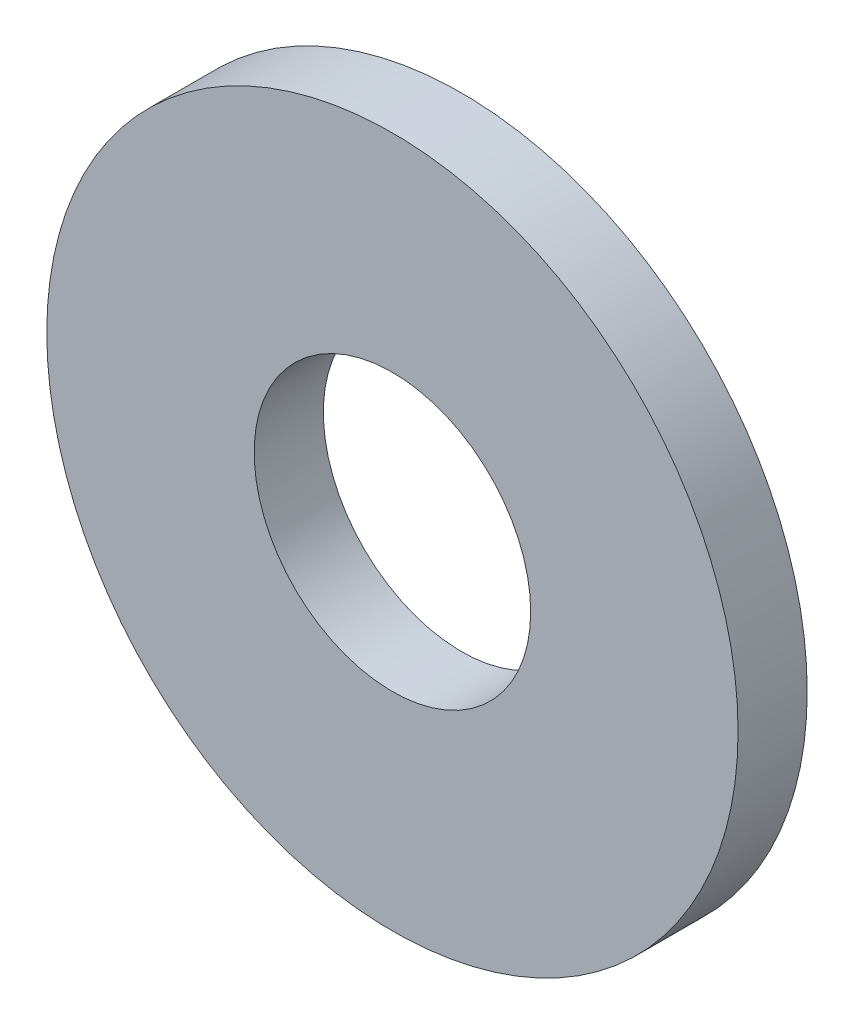
ISO-10303-21;
HEADER;
FILE_DESCRIPTION(('STEP AP214'),'2;1');
FILE_NAME('part.step','',(''),(''),'','','');
FILE_SCHEMA(('AUTOMOTIVE_DESIGN { 1 0 10303 214 1 1 1 1 }'));
ENDSEC;
DATA;
#1=APPLICATION_CONTEXT('core data for automotive mechanical design processes');
#2=APPLICATION_PROTOCOL_DEFINITION('international standard','automotive_design',2000,#1);
#3=PRODUCT_CONTEXT('',#1,'mechanical');
#4=PRODUCT('Part','Part','',(#3));
#5=PRODUCT_RELATED_PRODUCT_CATEGORY('part','',(#4));
#6=PRODUCT_DEFINITION_FORMATION('','',#4);
#7=PRODUCT_DEFINITION_CONTEXT('part definition',#1,'design');
#8=PRODUCT_DEFINITION('design','',#6,#7);
#9=PRODUCT_DEFINITION_SHAPE('','',#8);
#10=(LENGTH_UNIT() NAMED_UNIT(*) SI_UNIT(.MILLI.,.METRE.));
#11=(NAMED_UNIT(*) PLANE_ANGLE_UNIT() SI_UNIT($,.RADIAN.));
#12=(NAMED_UNIT(*) SI_UNIT($,.STERADIAN.) SOLID_ANGLE_UNIT());
#13=UNCERTAINTY_MEASURE_WITH_UNIT(LENGTH_MEASURE(1.E-05),#10,'distance_accuracy_value','');
#14=(GEOMETRIC_REPRESENTATION_CONTEXT(3) GLOBAL_UNCERTAINTY_ASSIGNED_CONTEXT((#13)) GLOBAL_UNIT_ASSIGNED_CONTEXT((#10,
#11,#12)) REPRESENTATION_CONTEXT('',''));
#15=CARTESIAN_POINT('',(0.,0.,0.));
#16=DIRECTION('',(0.,0.,1.));
#17=DIRECTION('',(1.,0.,0.));
#18=AXIS2_PLACEMENT_3D('',#15,#16,#17);
#19=CARTESIAN_POINT('',(0.,0.,5.));
#20=DIRECTION('',(0.,0.,1.));
#21=DIRECTION('',(1.,0.,0.));
#22=AXIS2_PLACEMENT_3D('',#19,#20,#21);
#23=PLANE('',#22);
#24=CARTESIAN_POINT('',(0.,0.,5.));
#25=DIRECTION('',(0.,0.,1.));
#26=DIRECTION('',(1.,0.,0.));
#27=AXIS2_PLACEMENT_3D('',#24,#25,#26);
#28=CIRCLE('',#27,25.);
#29=CARTESIAN_POINT('',(25.,0.,5.));
#30=VERTEX_POINT('',#29);
#31=EDGE_CURVE('E10',#30,#30,#28,.T.);
#32=ORIENTED_EDGE('',*,*,#31,.T.);
#33=EDGE_LOOP('',(#32));
#34=FACE_BOUND('',#33,.T.);
#35=CARTESIAN_POINT('',(0.,0.,5.));
#36=DIRECTION('',(0.,0.,1.));
#37=DIRECTION('',(1.,0.,0.));
#38=AXIS2_PLACEMENT_3D('',#35,#36,#37);
#39=CIRCLE('',#38,10.);
#40=CARTESIAN_POINT('',(10.,0.,5.));
#41=VERTEX_POINT('',#40);
#42=EDGE_CURVE('E50',#41,#41,#39,.T.);
#43=ORIENTED_EDGE('',*,*,#42,.F.);
#44=EDGE_LOOP('',(#43));
#45=FACE_BOUND('',#44,.T.);
#46=ADVANCED_FACE('F37',(#34,#45),#23,.T.);
#47=CARTESIAN_POINT('',(0.,0.,0.));
#48=DIRECTION('',(0.,0.,1.));
#49=DIRECTION('',(1.,0.,0.));
#50=AXIS2_PLACEMENT_3D('',#47,#48,#49);
#51=PLANE('',#50);
#52=CARTESIAN_POINT('',(0.,0.,0.));
#53=DIRECTION('',(0.,0.,1.));
#54=DIRECTION('',(1.,0.,0.));
#55=AXIS2_PLACEMENT_3D('',#52,#53,#54);
#56=CIRCLE('',#55,25.);
#57=CARTESIAN_POINT('',(25.,0.,0.));
#58=VERTEX_POINT('',#57);
#59=EDGE_CURVE('E41',#58,#58,#56,.T.);
#60=ORIENTED_EDGE('',*,*,#59,.F.);
#61=EDGE_LOOP('',(#60));
#62=FACE_BOUND('',#61,.T.);
#63=CARTESIAN_POINT('',(0.,0.,0.));
#64=DIRECTION('',(0.,0.,1.));
#65=DIRECTION('',(1.,0.,0.));
#66=AXIS2_PLACEMENT_3D('',#63,#64,#65);
#67=CIRCLE('',#66,10.);
#68=CARTESIAN_POINT('',(10.,0.,0.));
#69=VERTEX_POINT('',#68);
#70=EDGE_CURVE('E52',#69,#69,#67,.T.);
#71=ORIENTED_EDGE('',*,*,#70,.T.);
#72=EDGE_LOOP('',(#71));
#73=FACE_BOUND('',#72,.T.);
#74=ADVANCED_FACE('F64',(#62,#73),#51,.F.);
#75=CARTESIAN_POINT('',(0.,0.,5.));
#76=DIRECTION('',(0.,0.,-1.));
#77=DIRECTION('',(-1.,0.,0.));
#78=AXIS2_PLACEMENT_3D('',#75,#76,#77);
#79=CYLINDRICAL_SURFACE('',#78,25.);
#80=ORIENTED_EDGE('',*,*,#31,.F.);
#81=EDGE_LOOP('',(#80));
#82=FACE_BOUND('',#81,.T.);
#83=ORIENTED_EDGE('',*,*,#59,.T.);
#84=EDGE_LOOP('',(#83));
#85=FACE_BOUND('',#84,.T.);
#86=ADVANCED_FACE('F39',(#82,#85),#79,.T.);
#87=CARTESIAN_POINT('',(0.,0.,5.));
#88=DIRECTION('',(0.,0.,-1.));
#89=DIRECTION('',(-1.,0.,0.));
#90=AXIS2_PLACEMENT_3D('',#87,#88,#89);
#91=CYLINDRICAL_SURFACE('',#90,10.);
#92=ORIENTED_EDGE('',*,*,#42,.T.);
#93=EDGE_LOOP('',(#92));
#94=FACE_BOUND('',#93,.T.);
#95=ORIENTED_EDGE('',*,*,#70,.F.);
#96=EDGE_LOOP('',(#95));
#97=FACE_BOUND('',#96,.T.);
#98=ADVANCED_FACE('F60',(#94,#97),#91,.F.);
#99=CLOSED_SHELL('',(#46,#74,#86,#98));
#100=MANIFOLD_SOLID_BREP('B2',#99);
#101=ADVANCED_BREP_SHAPE_REPRESENTATION('',(#18,#100),#14);
#102=SHAPE_DEFINITION_REPRESENTATION(#9,#101);
ENDSEC;
END-ISO-10303-21;
